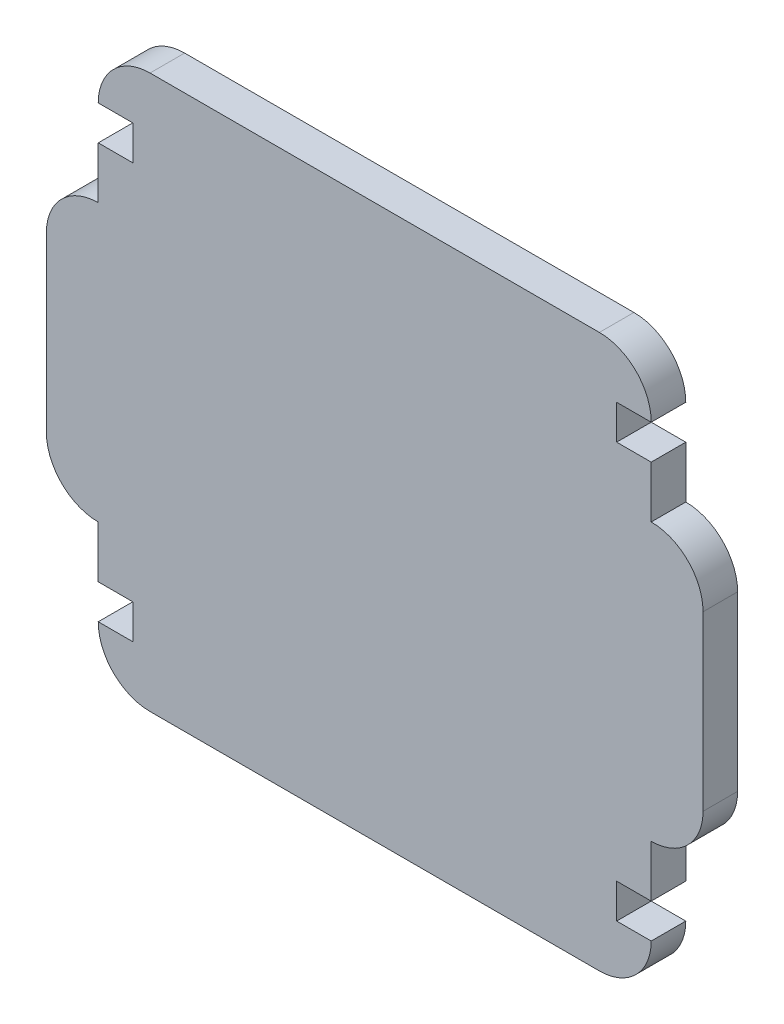
ISO-10303-21;
HEADER;
FILE_DESCRIPTION(('STEP AP214'),'2;1');
FILE_NAME('part.step','',(''),(''),'','','');
FILE_SCHEMA(('AUTOMOTIVE_DESIGN { 1 0 10303 214 1 1 1 1 }'));
ENDSEC;
DATA;
#1=APPLICATION_CONTEXT('core data for automotive mechanical design processes');
#2=APPLICATION_PROTOCOL_DEFINITION('international standard','automotive_design',2000,#1);
#3=PRODUCT_CONTEXT('',#1,'mechanical');
#4=PRODUCT('Part','Part','',(#3));
#5=PRODUCT_RELATED_PRODUCT_CATEGORY('part','',(#4));
#6=PRODUCT_DEFINITION_FORMATION('','',#4);
#7=PRODUCT_DEFINITION_CONTEXT('part definition',#1,'design');
#8=PRODUCT_DEFINITION('design','',#6,#7);
#9=PRODUCT_DEFINITION_SHAPE('','',#8);
#10=(LENGTH_UNIT() NAMED_UNIT(*) SI_UNIT(.MILLI.,.METRE.));
#11=(NAMED_UNIT(*) PLANE_ANGLE_UNIT() SI_UNIT($,.RADIAN.));
#12=(NAMED_UNIT(*) SI_UNIT($,.STERADIAN.) SOLID_ANGLE_UNIT());
#13=UNCERTAINTY_MEASURE_WITH_UNIT(LENGTH_MEASURE(1.E-05),#10,'distance_accuracy_value','');
#14=(GEOMETRIC_REPRESENTATION_CONTEXT(3) GLOBAL_UNCERTAINTY_ASSIGNED_CONTEXT((#13)) GLOBAL_UNIT_ASSIGNED_CONTEXT((#10,
#11,#12)) REPRESENTATION_CONTEXT('',''));
#15=CARTESIAN_POINT('',(0.,0.,0.));
#16=DIRECTION('',(0.,0.,1.));
#17=DIRECTION('',(1.,0.,0.));
#18=AXIS2_PLACEMENT_3D('',#15,#16,#17);
#19=CARTESIAN_POINT('',(-25.4,-7.93750000000001,3.175));
#20=DIRECTION('',(0.,0.,-1.));
#21=DIRECTION('',(-1.,0.,0.));
#22=AXIS2_PLACEMENT_3D('',#19,#20,#21);
#23=CYLINDRICAL_SURFACE('',#22,4.7625);
#24=CARTESIAN_POINT('',(-25.4,-7.93750000000001,0.));
#25=DIRECTION('',(0.,0.,1.));
#26=DIRECTION('',(1.,0.,0.));
#27=AXIS2_PLACEMENT_3D('',#24,#25,#26);
#28=CIRCLE('',#27,4.7625);
#29=CARTESIAN_POINT('',(-25.4,-12.7,0.));
#30=VERTEX_POINT('',#29);
#31=CARTESIAN_POINT('',(-30.1625,-7.93750000000001,0.));
#32=VERTEX_POINT('',#31);
#33=EDGE_CURVE('E250',#30,#32,#28,.F.);
#34=ORIENTED_EDGE('',*,*,#33,.F.);
#35=DIRECTION('',(0.,0.,-1.));
#36=VECTOR('',#35,1.);
#37=CARTESIAN_POINT('',(-25.4,-12.7,3.175));
#38=LINE('',#37,#36);
#39=CARTESIAN_POINT('',(-25.4,-12.7,3.175));
#40=VERTEX_POINT('',#39);
#41=EDGE_CURVE('E11',#40,#30,#38,.T.);
#42=ORIENTED_EDGE('',*,*,#41,.F.);
#43=CARTESIAN_POINT('',(-25.4,-7.93750000000001,3.175));
#44=DIRECTION('',(0.,0.,1.));
#45=DIRECTION('',(1.,0.,0.));
#46=AXIS2_PLACEMENT_3D('',#43,#44,#45);
#47=CIRCLE('',#46,4.7625);
#48=CARTESIAN_POINT('',(-30.1625,-7.93750000000001,3.175));
#49=VERTEX_POINT('',#48);
#50=EDGE_CURVE('E324',#40,#49,#47,.F.);
#51=ORIENTED_EDGE('',*,*,#50,.T.);
#52=DIRECTION('',(0.,0.,-1.));
#53=VECTOR('',#52,1.);
#54=CARTESIAN_POINT('',(-30.1625,-7.93750000000001,3.175));
#55=LINE('',#54,#53);
#56=EDGE_CURVE('E52',#49,#32,#55,.T.);
#57=ORIENTED_EDGE('',*,*,#56,.T.);
#58=EDGE_LOOP('',(#34,#42,#51,#57));
#59=FACE_BOUND('',#58,.T.);
#60=ADVANCED_FACE('F36',(#59),#23,.T.);
#61=CARTESIAN_POINT('',(-25.4,0.,3.175));
#62=DIRECTION('',(1.,0.,0.));
#63=DIRECTION('',(0.,0.,-1.));
#64=AXIS2_PLACEMENT_3D('',#61,#62,#63);
#65=PLANE('',#64);
#66=DIRECTION('',(0.,-1.,0.));
#67=VECTOR('',#66,1.);
#68=CARTESIAN_POINT('',(-25.4,0.,0.));
#69=LINE('',#68,#67);
#70=CARTESIAN_POINT('',(-25.4,-17.4625,0.));
#71=VERTEX_POINT('',#70);
#72=EDGE_CURVE('E252',#30,#71,#69,.T.);
#73=ORIENTED_EDGE('',*,*,#72,.T.);
#74=DIRECTION('',(0.,0.,-1.));
#75=VECTOR('',#74,1.);
#76=CARTESIAN_POINT('',(-25.4,-17.4625,3.175));
#77=LINE('',#76,#75);
#78=CARTESIAN_POINT('',(-25.4,-17.4625,3.175));
#79=VERTEX_POINT('',#78);
#80=EDGE_CURVE('E44',#79,#71,#77,.T.);
#81=ORIENTED_EDGE('',*,*,#80,.F.);
#82=DIRECTION('',(0.,-1.,0.));
#83=VECTOR('',#82,1.);
#84=CARTESIAN_POINT('',(-25.4,0.,3.175));
#85=LINE('',#84,#83);
#86=EDGE_CURVE('E397',#40,#79,#85,.T.);
#87=ORIENTED_EDGE('',*,*,#86,.F.);
#88=ORIENTED_EDGE('',*,*,#41,.T.);
#89=EDGE_LOOP('',(#73,#81,#87,#88));
#90=FACE_BOUND('',#89,.T.);
#91=ADVANCED_FACE('F385',(#90),#65,.F.);
#92=CARTESIAN_POINT('',(0.,-17.4625,3.175));
#93=DIRECTION('',(0.,-1.,0.));
#94=DIRECTION('',(0.,0.,-1.));
#95=AXIS2_PLACEMENT_3D('',#92,#93,#94);
#96=PLANE('',#95);
#97=DIRECTION('',(-1.,0.,0.));
#98=VECTOR('',#97,1.);
#99=CARTESIAN_POINT('',(0.,-17.4625,0.));
#100=LINE('',#99,#98);
#101=CARTESIAN_POINT('',(-22.225,-17.4625,0.));
#102=VERTEX_POINT('',#101);
#103=EDGE_CURVE('E255',#102,#71,#100,.T.);
#104=ORIENTED_EDGE('',*,*,#103,.F.);
#105=DIRECTION('',(0.,0.,-1.));
#106=VECTOR('',#105,1.);
#107=CARTESIAN_POINT('',(-22.225,-17.4625,3.175));
#108=LINE('',#107,#106);
#109=CARTESIAN_POINT('',(-22.225,-17.4625,3.175));
#110=VERTEX_POINT('',#109);
#111=EDGE_CURVE('E375',#110,#102,#108,.T.);
#112=ORIENTED_EDGE('',*,*,#111,.F.);
#113=DIRECTION('',(-1.,0.,0.));
#114=VECTOR('',#113,1.);
#115=CARTESIAN_POINT('',(0.,-17.4625,3.175));
#116=LINE('',#115,#114);
#117=EDGE_CURVE('E382',#110,#79,#116,.T.);
#118=ORIENTED_EDGE('',*,*,#117,.T.);
#119=ORIENTED_EDGE('',*,*,#80,.T.);
#120=EDGE_LOOP('',(#104,#112,#118,#119));
#121=FACE_BOUND('',#120,.T.);
#122=ADVANCED_FACE('F380',(#121),#96,.T.);
#123=CARTESIAN_POINT('',(-22.225,0.,3.175));
#124=DIRECTION('',(-1.,0.,0.));
#125=DIRECTION('',(0.,0.,1.));
#126=AXIS2_PLACEMENT_3D('',#123,#124,#125);
#127=PLANE('',#126);
#128=DIRECTION('',(0.,1.,0.));
#129=VECTOR('',#128,1.);
#130=CARTESIAN_POINT('',(-22.225,0.,0.));
#131=LINE('',#130,#129);
#132=CARTESIAN_POINT('',(-22.225,-20.6375,0.));
#133=VERTEX_POINT('',#132);
#134=EDGE_CURVE('E258',#133,#102,#131,.T.);
#135=ORIENTED_EDGE('',*,*,#134,.F.);
#136=DIRECTION('',(0.,0.,-1.));
#137=VECTOR('',#136,1.);
#138=CARTESIAN_POINT('',(-22.225,-20.6375,3.175));
#139=LINE('',#138,#137);
#140=CARTESIAN_POINT('',(-22.225,-20.6375,3.175));
#141=VERTEX_POINT('',#140);
#142=EDGE_CURVE('E373',#141,#133,#139,.T.);
#143=ORIENTED_EDGE('',*,*,#142,.F.);
#144=DIRECTION('',(0.,1.,0.));
#145=VECTOR('',#144,1.);
#146=CARTESIAN_POINT('',(-22.225,0.,3.175));
#147=LINE('',#146,#145);
#148=EDGE_CURVE('E396',#141,#110,#147,.T.);
#149=ORIENTED_EDGE('',*,*,#148,.T.);
#150=ORIENTED_EDGE('',*,*,#111,.T.);
#151=EDGE_LOOP('',(#135,#143,#149,#150));
#152=FACE_BOUND('',#151,.T.);
#153=ADVANCED_FACE('F392',(#152),#127,.T.);
#154=CARTESIAN_POINT('',(0.,-20.6375,3.175));
#155=DIRECTION('',(0.,-1.,0.));
#156=DIRECTION('',(1.,0.,0.));
#157=AXIS2_PLACEMENT_3D('',#154,#155,#156);
#158=PLANE('',#157);
#159=DIRECTION('',(-1.,0.,0.));
#160=VECTOR('',#159,1.);
#161=CARTESIAN_POINT('',(0.,-20.6375,0.));
#162=LINE('',#161,#160);
#163=CARTESIAN_POINT('',(-25.4,-20.6375,0.));
#164=VERTEX_POINT('',#163);
#165=EDGE_CURVE('E261',#133,#164,#162,.T.);
#166=ORIENTED_EDGE('',*,*,#165,.T.);
#167=DIRECTION('',(0.,0.,-1.));
#168=VECTOR('',#167,1.);
#169=CARTESIAN_POINT('',(-25.4,-20.6375,3.175));
#170=LINE('',#169,#168);
#171=CARTESIAN_POINT('',(-25.4,-20.6375,3.175));
#172=VERTEX_POINT('',#171);
#173=EDGE_CURVE('E370',#172,#164,#170,.T.);
#174=ORIENTED_EDGE('',*,*,#173,.F.);
#175=DIRECTION('',(-1.,0.,0.));
#176=VECTOR('',#175,1.);
#177=CARTESIAN_POINT('',(0.,-20.6375,3.175));
#178=LINE('',#177,#176);
#179=EDGE_CURVE('E399',#141,#172,#178,.T.);
#180=ORIENTED_EDGE('',*,*,#179,.F.);
#181=ORIENTED_EDGE('',*,*,#142,.T.);
#182=EDGE_LOOP('',(#166,#174,#180,#181));
#183=FACE_BOUND('',#182,.T.);
#184=ADVANCED_FACE('F484',(#183),#158,.F.);
#185=CARTESIAN_POINT('',(-20.6375,-20.6375,3.175));
#186=DIRECTION('',(0.,0.,-1.));
#187=DIRECTION('',(-1.,0.,0.));
#188=AXIS2_PLACEMENT_3D('',#185,#186,#187);
#189=CYLINDRICAL_SURFACE('',#188,4.7625);
#190=CARTESIAN_POINT('',(-20.6375,-20.6375,0.));
#191=DIRECTION('',(0.,0.,1.));
#192=DIRECTION('',(1.,0.,0.));
#193=AXIS2_PLACEMENT_3D('',#190,#191,#192);
#194=CIRCLE('',#193,4.7625);
#195=CARTESIAN_POINT('',(-20.6375,-25.4,0.));
#196=VERTEX_POINT('',#195);
#197=EDGE_CURVE('E263',#164,#196,#194,.T.);
#198=ORIENTED_EDGE('',*,*,#197,.T.);
#199=DIRECTION('',(0.,0.,-1.));
#200=VECTOR('',#199,1.);
#201=CARTESIAN_POINT('',(-20.6375,-25.4,3.175));
#202=LINE('',#201,#200);
#203=CARTESIAN_POINT('',(-20.6375,-25.4,3.175));
#204=VERTEX_POINT('',#203);
#205=EDGE_CURVE('E367',#204,#196,#202,.T.);
#206=ORIENTED_EDGE('',*,*,#205,.F.);
#207=CARTESIAN_POINT('',(-20.6375,-20.6375,3.175));
#208=DIRECTION('',(0.,0.,1.));
#209=DIRECTION('',(1.,0.,0.));
#210=AXIS2_PLACEMENT_3D('',#207,#208,#209);
#211=CIRCLE('',#210,4.7625);
#212=EDGE_CURVE('E405',#172,#204,#211,.T.);
#213=ORIENTED_EDGE('',*,*,#212,.F.);
#214=ORIENTED_EDGE('',*,*,#173,.T.);
#215=EDGE_LOOP('',(#198,#206,#213,#214));
#216=FACE_BOUND('',#215,.T.);
#217=ADVANCED_FACE('F487',(#216),#189,.T.);
#218=CARTESIAN_POINT('',(0.,-25.4,3.175));
#219=DIRECTION('',(0.,1.,0.));
#220=DIRECTION('',(-1.,0.,0.));
#221=AXIS2_PLACEMENT_3D('',#218,#219,#220);
#222=PLANE('',#221);
#223=DIRECTION('',(1.,0.,0.));
#224=VECTOR('',#223,1.);
#225=CARTESIAN_POINT('',(0.,-25.4,0.));
#226=LINE('',#225,#224);
#227=CARTESIAN_POINT('',(20.6375,-25.4,0.));
#228=VERTEX_POINT('',#227);
#229=EDGE_CURVE('E265',#196,#228,#226,.T.);
#230=ORIENTED_EDGE('',*,*,#229,.T.);
#231=DIRECTION('',(0.,0.,-1.));
#232=VECTOR('',#231,1.);
#233=CARTESIAN_POINT('',(20.6375,-25.4,3.175));
#234=LINE('',#233,#232);
#235=CARTESIAN_POINT('',(20.6375,-25.4,3.175));
#236=VERTEX_POINT('',#235);
#237=EDGE_CURVE('E365',#236,#228,#234,.T.);
#238=ORIENTED_EDGE('',*,*,#237,.F.);
#239=DIRECTION('',(1.,0.,0.));
#240=VECTOR('',#239,1.);
#241=CARTESIAN_POINT('',(0.,-25.4,3.175));
#242=LINE('',#241,#240);
#243=EDGE_CURVE('E407',#204,#236,#242,.T.);
#244=ORIENTED_EDGE('',*,*,#243,.F.);
#245=ORIENTED_EDGE('',*,*,#205,.T.);
#246=EDGE_LOOP('',(#230,#238,#244,#245));
#247=FACE_BOUND('',#246,.T.);
#248=ADVANCED_FACE('F491',(#247),#222,.F.);
#249=CARTESIAN_POINT('',(20.6375,-20.6375,3.175));
#250=DIRECTION('',(0.,0.,-1.));
#251=DIRECTION('',(-1.,0.,0.));
#252=AXIS2_PLACEMENT_3D('',#249,#250,#251);
#253=CYLINDRICAL_SURFACE('',#252,4.76249999999999);
#254=CARTESIAN_POINT('',(20.6375,-20.6375,0.));
#255=DIRECTION('',(0.,0.,1.));
#256=DIRECTION('',(1.,0.,0.));
#257=AXIS2_PLACEMENT_3D('',#254,#255,#256);
#258=CIRCLE('',#257,4.76249999999999);
#259=CARTESIAN_POINT('',(25.4,-20.6375,0.));
#260=VERTEX_POINT('',#259);
#261=EDGE_CURVE('E268',#260,#228,#258,.F.);
#262=ORIENTED_EDGE('',*,*,#261,.F.);
#263=DIRECTION('',(0.,0.,-1.));
#264=VECTOR('',#263,1.);
#265=CARTESIAN_POINT('',(25.4,-20.6375,3.175));
#266=LINE('',#265,#264);
#267=CARTESIAN_POINT('',(25.4,-20.6375,3.175));
#268=VERTEX_POINT('',#267);
#269=EDGE_CURVE('E363',#268,#260,#266,.T.);
#270=ORIENTED_EDGE('',*,*,#269,.F.);
#271=CARTESIAN_POINT('',(20.6375,-20.6375,3.175));
#272=DIRECTION('',(0.,0.,1.));
#273=DIRECTION('',(1.,0.,0.));
#274=AXIS2_PLACEMENT_3D('',#271,#272,#273);
#275=CIRCLE('',#274,4.76249999999999);
#276=EDGE_CURVE('E409',#268,#236,#275,.F.);
#277=ORIENTED_EDGE('',*,*,#276,.T.);
#278=ORIENTED_EDGE('',*,*,#237,.T.);
#279=EDGE_LOOP('',(#262,#270,#277,#278));
#280=FACE_BOUND('',#279,.T.);
#281=ADVANCED_FACE('F495',(#280),#253,.T.);
#282=CARTESIAN_POINT('',(0.,-20.6375,3.175));
#283=DIRECTION('',(0.,1.,0.));
#284=DIRECTION('',(-1.,0.,0.));
#285=AXIS2_PLACEMENT_3D('',#282,#283,#284);
#286=PLANE('',#285);
#287=DIRECTION('',(1.,0.,0.));
#288=VECTOR('',#287,1.);
#289=CARTESIAN_POINT('',(0.,-20.6375,0.));
#290=LINE('',#289,#288);
#291=CARTESIAN_POINT('',(22.225,-20.6375,0.));
#292=VERTEX_POINT('',#291);
#293=EDGE_CURVE('E271',#292,#260,#290,.T.);
#294=ORIENTED_EDGE('',*,*,#293,.F.);
#295=DIRECTION('',(0.,0.,-1.));
#296=VECTOR('',#295,1.);
#297=CARTESIAN_POINT('',(22.225,-20.6375,3.175));
#298=LINE('',#297,#296);
#299=CARTESIAN_POINT('',(22.225,-20.6375,3.175));
#300=VERTEX_POINT('',#299);
#301=EDGE_CURVE('E361',#300,#292,#298,.T.);
#302=ORIENTED_EDGE('',*,*,#301,.F.);
#303=DIRECTION('',(1.,0.,0.));
#304=VECTOR('',#303,1.);
#305=CARTESIAN_POINT('',(0.,-20.6375,3.175));
#306=LINE('',#305,#304);
#307=EDGE_CURVE('E412',#300,#268,#306,.T.);
#308=ORIENTED_EDGE('',*,*,#307,.T.);
#309=ORIENTED_EDGE('',*,*,#269,.T.);
#310=EDGE_LOOP('',(#294,#302,#308,#309));
#311=FACE_BOUND('',#310,.T.);
#312=ADVANCED_FACE('F499',(#311),#286,.T.);
#313=CARTESIAN_POINT('',(22.225,0.,3.175));
#314=DIRECTION('',(-1.,0.,0.));
#315=DIRECTION('',(0.,0.,1.));
#316=AXIS2_PLACEMENT_3D('',#313,#314,#315);
#317=PLANE('',#316);
#318=DIRECTION('',(0.,1.,0.));
#319=VECTOR('',#318,1.);
#320=CARTESIAN_POINT('',(22.225,0.,0.));
#321=LINE('',#320,#319);
#322=CARTESIAN_POINT('',(22.225,-17.4625,0.));
#323=VERTEX_POINT('',#322);
#324=EDGE_CURVE('E274',#292,#323,#321,.T.);
#325=ORIENTED_EDGE('',*,*,#324,.T.);
#326=DIRECTION('',(0.,0.,-1.));
#327=VECTOR('',#326,1.);
#328=CARTESIAN_POINT('',(22.225,-17.4625,3.175));
#329=LINE('',#328,#327);
#330=CARTESIAN_POINT('',(22.225,-17.4625,3.175));
#331=VERTEX_POINT('',#330);
#332=EDGE_CURVE('E358',#331,#323,#329,.T.);
#333=ORIENTED_EDGE('',*,*,#332,.F.);
#334=DIRECTION('',(0.,1.,0.));
#335=VECTOR('',#334,1.);
#336=CARTESIAN_POINT('',(22.225,0.,3.175));
#337=LINE('',#336,#335);
#338=EDGE_CURVE('E415',#300,#331,#337,.T.);
#339=ORIENTED_EDGE('',*,*,#338,.F.);
#340=ORIENTED_EDGE('',*,*,#301,.T.);
#341=EDGE_LOOP('',(#325,#333,#339,#340));
#342=FACE_BOUND('',#341,.T.);
#343=ADVANCED_FACE('F503',(#342),#317,.F.);
#344=CARTESIAN_POINT('',(0.,-17.4625,3.175));
#345=DIRECTION('',(0.,1.,0.));
#346=DIRECTION('',(0.,0.,1.));
#347=AXIS2_PLACEMENT_3D('',#344,#345,#346);
#348=PLANE('',#347);
#349=DIRECTION('',(1.,0.,0.));
#350=VECTOR('',#349,1.);
#351=CARTESIAN_POINT('',(0.,-17.4625,0.));
#352=LINE('',#351,#350);
#353=CARTESIAN_POINT('',(25.4,-17.4625,0.));
#354=VERTEX_POINT('',#353);
#355=EDGE_CURVE('E276',#323,#354,#352,.T.);
#356=ORIENTED_EDGE('',*,*,#355,.T.);
#357=DIRECTION('',(0.,0.,-1.));
#358=VECTOR('',#357,1.);
#359=CARTESIAN_POINT('',(25.4,-17.4625,3.175));
#360=LINE('',#359,#358);
#361=CARTESIAN_POINT('',(25.4,-17.4625,3.175));
#362=VERTEX_POINT('',#361);
#363=EDGE_CURVE('E356',#362,#354,#360,.T.);
#364=ORIENTED_EDGE('',*,*,#363,.F.);
#365=DIRECTION('',(1.,0.,0.));
#366=VECTOR('',#365,1.);
#367=CARTESIAN_POINT('',(0.,-17.4625,3.175));
#368=LINE('',#367,#366);
#369=EDGE_CURVE('E417',#331,#362,#368,.T.);
#370=ORIENTED_EDGE('',*,*,#369,.F.);
#371=ORIENTED_EDGE('',*,*,#332,.T.);
#372=EDGE_LOOP('',(#356,#364,#370,#371));
#373=FACE_BOUND('',#372,.T.);
#374=ADVANCED_FACE('F507',(#373),#348,.F.);
#375=CARTESIAN_POINT('',(25.4,0.,3.175));
#376=DIRECTION('',(1.,0.,0.));
#377=DIRECTION('',(0.,0.,-1.));
#378=AXIS2_PLACEMENT_3D('',#375,#376,#377);
#379=PLANE('',#378);
#380=DIRECTION('',(0.,-1.,0.));
#381=VECTOR('',#380,1.);
#382=CARTESIAN_POINT('',(25.4,0.,0.));
#383=LINE('',#382,#381);
#384=CARTESIAN_POINT('',(25.4,-12.7,0.));
#385=VERTEX_POINT('',#384);
#386=EDGE_CURVE('E279',#385,#354,#383,.T.);
#387=ORIENTED_EDGE('',*,*,#386,.F.);
#388=DIRECTION('',(0.,0.,-1.));
#389=VECTOR('',#388,1.);
#390=CARTESIAN_POINT('',(25.4,-12.7,3.175));
#391=LINE('',#390,#389);
#392=CARTESIAN_POINT('',(25.4,-12.7,3.175));
#393=VERTEX_POINT('',#392);
#394=EDGE_CURVE('E354',#393,#385,#391,.T.);
#395=ORIENTED_EDGE('',*,*,#394,.F.);
#396=DIRECTION('',(0.,-1.,0.));
#397=VECTOR('',#396,1.);
#398=CARTESIAN_POINT('',(25.4,0.,3.175));
#399=LINE('',#398,#397);
#400=EDGE_CURVE('E419',#393,#362,#399,.T.);
#401=ORIENTED_EDGE('',*,*,#400,.T.);
#402=ORIENTED_EDGE('',*,*,#363,.T.);
#403=EDGE_LOOP('',(#387,#395,#401,#402));
#404=FACE_BOUND('',#403,.T.);
#405=ADVANCED_FACE('F511',(#404),#379,.T.);
#406=CARTESIAN_POINT('',(25.4,-7.93750000000001,3.175));
#407=DIRECTION('',(0.,0.,-1.));
#408=DIRECTION('',(-1.,0.,0.));
#409=AXIS2_PLACEMENT_3D('',#406,#407,#408);
#410=CYLINDRICAL_SURFACE('',#409,4.7625);
#411=CARTESIAN_POINT('',(25.4,-7.93750000000001,0.));
#412=DIRECTION('',(0.,0.,1.));
#413=DIRECTION('',(1.,0.,0.));
#414=AXIS2_PLACEMENT_3D('',#411,#412,#413);
#415=CIRCLE('',#414,4.7625);
#416=CARTESIAN_POINT('',(30.1625,-7.93750000000001,0.));
#417=VERTEX_POINT('',#416);
#418=EDGE_CURVE('E282',#385,#417,#415,.T.);
#419=ORIENTED_EDGE('',*,*,#418,.T.);
#420=DIRECTION('',(0.,0.,-1.));
#421=VECTOR('',#420,1.);
#422=CARTESIAN_POINT('',(30.1625,-7.93750000000001,3.175));
#423=LINE('',#422,#421);
#424=CARTESIAN_POINT('',(30.1625,-7.93750000000001,3.175));
#425=VERTEX_POINT('',#424);
#426=EDGE_CURVE('E352',#425,#417,#423,.T.);
#427=ORIENTED_EDGE('',*,*,#426,.F.);
#428=CARTESIAN_POINT('',(25.4,-7.93750000000001,3.175));
#429=DIRECTION('',(0.,0.,1.));
#430=DIRECTION('',(1.,0.,0.));
#431=AXIS2_PLACEMENT_3D('',#428,#429,#430);
#432=CIRCLE('',#431,4.7625);
#433=EDGE_CURVE('E422',#393,#425,#432,.T.);
#434=ORIENTED_EDGE('',*,*,#433,.F.);
#435=ORIENTED_EDGE('',*,*,#394,.T.);
#436=EDGE_LOOP('',(#419,#427,#434,#435));
#437=FACE_BOUND('',#436,.T.);
#438=ADVANCED_FACE('F515',(#437),#410,.T.);
#439=CARTESIAN_POINT('',(30.1625,0.,3.175));
#440=DIRECTION('',(1.,0.,0.));
#441=DIRECTION('',(0.,0.,-1.));
#442=AXIS2_PLACEMENT_3D('',#439,#440,#441);
#443=PLANE('',#442);
#444=DIRECTION('',(0.,-1.,0.));
#445=VECTOR('',#444,1.);
#446=CARTESIAN_POINT('',(30.1625,0.,0.));
#447=LINE('',#446,#445);
#448=CARTESIAN_POINT('',(30.1625,7.93750000000001,0.));
#449=VERTEX_POINT('',#448);
#450=EDGE_CURVE('E285',#449,#417,#447,.T.);
#451=ORIENTED_EDGE('',*,*,#450,.F.);
#452=DIRECTION('',(0.,0.,-1.));
#453=VECTOR('',#452,1.);
#454=CARTESIAN_POINT('',(30.1625,7.93750000000001,3.175));
#455=LINE('',#454,#453);
#456=CARTESIAN_POINT('',(30.1625,7.93750000000001,3.175));
#457=VERTEX_POINT('',#456);
#458=EDGE_CURVE('E350',#457,#449,#455,.T.);
#459=ORIENTED_EDGE('',*,*,#458,.F.);
#460=DIRECTION('',(0.,-1.,0.));
#461=VECTOR('',#460,1.);
#462=CARTESIAN_POINT('',(30.1625,0.,3.175));
#463=LINE('',#462,#461);
#464=EDGE_CURVE('E424',#457,#425,#463,.T.);
#465=ORIENTED_EDGE('',*,*,#464,.T.);
#466=ORIENTED_EDGE('',*,*,#426,.T.);
#467=EDGE_LOOP('',(#451,#459,#465,#466));
#468=FACE_BOUND('',#467,.T.);
#469=ADVANCED_FACE('F519',(#468),#443,.T.);
#470=CARTESIAN_POINT('',(25.4,7.93750000000001,3.175));
#471=DIRECTION('',(0.,0.,-1.));
#472=DIRECTION('',(-1.,0.,0.));
#473=AXIS2_PLACEMENT_3D('',#470,#471,#472);
#474=CYLINDRICAL_SURFACE('',#473,4.7625);
#475=CARTESIAN_POINT('',(25.4,7.93750000000001,0.));
#476=DIRECTION('',(0.,0.,1.));
#477=DIRECTION('',(1.,0.,0.));
#478=AXIS2_PLACEMENT_3D('',#475,#476,#477);
#479=CIRCLE('',#478,4.7625);
#480=CARTESIAN_POINT('',(25.4,12.7,0.));
#481=VERTEX_POINT('',#480);
#482=EDGE_CURVE('E288',#481,#449,#479,.F.);
#483=ORIENTED_EDGE('',*,*,#482,.F.);
#484=DIRECTION('',(0.,0.,-1.));
#485=VECTOR('',#484,1.);
#486=CARTESIAN_POINT('',(25.4,12.7,3.175));
#487=LINE('',#486,#485);
#488=CARTESIAN_POINT('',(25.4,12.7,3.175));
#489=VERTEX_POINT('',#488);
#490=EDGE_CURVE('E348',#489,#481,#487,.T.);
#491=ORIENTED_EDGE('',*,*,#490,.F.);
#492=CARTESIAN_POINT('',(25.4,7.93750000000001,3.175));
#493=DIRECTION('',(0.,0.,1.));
#494=DIRECTION('',(1.,0.,0.));
#495=AXIS2_PLACEMENT_3D('',#492,#493,#494);
#496=CIRCLE('',#495,4.7625);
#497=EDGE_CURVE('E427',#489,#457,#496,.F.);
#498=ORIENTED_EDGE('',*,*,#497,.T.);
#499=ORIENTED_EDGE('',*,*,#458,.T.);
#500=EDGE_LOOP('',(#483,#491,#498,#499));
#501=FACE_BOUND('',#500,.T.);
#502=ADVANCED_FACE('F523',(#501),#474,.T.);
#503=CARTESIAN_POINT('',(25.4,0.,3.175));
#504=DIRECTION('',(1.,0.,0.));
#505=DIRECTION('',(0.,0.,-1.));
#506=AXIS2_PLACEMENT_3D('',#503,#504,#505);
#507=PLANE('',#506);
#508=DIRECTION('',(0.,-1.,0.));
#509=VECTOR('',#508,1.);
#510=CARTESIAN_POINT('',(25.4,0.,0.));
#511=LINE('',#510,#509);
#512=CARTESIAN_POINT('',(25.4,17.4625,0.));
#513=VERTEX_POINT('',#512);
#514=EDGE_CURVE('E291',#513,#481,#511,.T.);
#515=ORIENTED_EDGE('',*,*,#514,.F.);
#516=DIRECTION('',(0.,0.,-1.));
#517=VECTOR('',#516,1.);
#518=CARTESIAN_POINT('',(25.4,17.4625,3.175));
#519=LINE('',#518,#517);
#520=CARTESIAN_POINT('',(25.4,17.4625,3.175));
#521=VERTEX_POINT('',#520);
#522=EDGE_CURVE('E346',#521,#513,#519,.T.);
#523=ORIENTED_EDGE('',*,*,#522,.F.);
#524=DIRECTION('',(0.,-1.,0.));
#525=VECTOR('',#524,1.);
#526=CARTESIAN_POINT('',(25.4,0.,3.175));
#527=LINE('',#526,#525);
#528=EDGE_CURVE('E430',#521,#489,#527,.T.);
#529=ORIENTED_EDGE('',*,*,#528,.T.);
#530=ORIENTED_EDGE('',*,*,#490,.T.);
#531=EDGE_LOOP('',(#515,#523,#529,#530));
#532=FACE_BOUND('',#531,.T.);
#533=ADVANCED_FACE('F527',(#532),#507,.T.);
#534=CARTESIAN_POINT('',(0.,17.4625,3.175));
#535=DIRECTION('',(0.,1.,0.));
#536=DIRECTION('',(0.,0.,1.));
#537=AXIS2_PLACEMENT_3D('',#534,#535,#536);
#538=PLANE('',#537);
#539=DIRECTION('',(1.,0.,0.));
#540=VECTOR('',#539,1.);
#541=CARTESIAN_POINT('',(0.,17.4625,0.));
#542=LINE('',#541,#540);
#543=CARTESIAN_POINT('',(22.225,17.4625,0.));
#544=VERTEX_POINT('',#543);
#545=EDGE_CURVE('E294',#544,#513,#542,.T.);
#546=ORIENTED_EDGE('',*,*,#545,.F.);
#547=DIRECTION('',(0.,0.,-1.));
#548=VECTOR('',#547,1.);
#549=CARTESIAN_POINT('',(22.225,17.4625,3.175));
#550=LINE('',#549,#548);
#551=CARTESIAN_POINT('',(22.225,17.4625,3.175));
#552=VERTEX_POINT('',#551);
#553=EDGE_CURVE('E344',#552,#544,#550,.T.);
#554=ORIENTED_EDGE('',*,*,#553,.F.);
#555=DIRECTION('',(1.,0.,0.));
#556=VECTOR('',#555,1.);
#557=CARTESIAN_POINT('',(0.,17.4625,3.175));
#558=LINE('',#557,#556);
#559=EDGE_CURVE('E433',#552,#521,#558,.T.);
#560=ORIENTED_EDGE('',*,*,#559,.T.);
#561=ORIENTED_EDGE('',*,*,#522,.T.);
#562=EDGE_LOOP('',(#546,#554,#560,#561));
#563=FACE_BOUND('',#562,.T.);
#564=ADVANCED_FACE('F531',(#563),#538,.T.);
#565=CARTESIAN_POINT('',(22.225,0.,3.175));
#566=DIRECTION('',(1.,0.,0.));
#567=DIRECTION('',(0.,0.,-1.));
#568=AXIS2_PLACEMENT_3D('',#565,#566,#567);
#569=PLANE('',#568);
#570=DIRECTION('',(0.,-1.,0.));
#571=VECTOR('',#570,1.);
#572=CARTESIAN_POINT('',(22.225,0.,0.));
#573=LINE('',#572,#571);
#574=CARTESIAN_POINT('',(22.225,20.6375,0.));
#575=VERTEX_POINT('',#574);
#576=EDGE_CURVE('E297',#575,#544,#573,.T.);
#577=ORIENTED_EDGE('',*,*,#576,.F.);
#578=DIRECTION('',(0.,0.,-1.));
#579=VECTOR('',#578,1.);
#580=CARTESIAN_POINT('',(22.225,20.6375,3.175));
#581=LINE('',#580,#579);
#582=CARTESIAN_POINT('',(22.225,20.6375,3.175));
#583=VERTEX_POINT('',#582);
#584=EDGE_CURVE('E342',#583,#575,#581,.T.);
#585=ORIENTED_EDGE('',*,*,#584,.F.);
#586=DIRECTION('',(0.,-1.,0.));
#587=VECTOR('',#586,1.);
#588=CARTESIAN_POINT('',(22.225,0.,3.175));
#589=LINE('',#588,#587);
#590=EDGE_CURVE('E436',#583,#552,#589,.T.);
#591=ORIENTED_EDGE('',*,*,#590,.T.);
#592=ORIENTED_EDGE('',*,*,#553,.T.);
#593=EDGE_LOOP('',(#577,#585,#591,#592));
#594=FACE_BOUND('',#593,.T.);
#595=ADVANCED_FACE('F535',(#594),#569,.T.);
#596=CARTESIAN_POINT('',(0.,20.6375,3.175));
#597=DIRECTION('',(0.,1.,0.));
#598=DIRECTION('',(-1.,0.,0.));
#599=AXIS2_PLACEMENT_3D('',#596,#597,#598);
#600=PLANE('',#599);
#601=DIRECTION('',(1.,0.,0.));
#602=VECTOR('',#601,1.);
#603=CARTESIAN_POINT('',(0.,20.6375,0.));
#604=LINE('',#603,#602);
#605=CARTESIAN_POINT('',(25.4,20.6375,0.));
#606=VERTEX_POINT('',#605);
#607=EDGE_CURVE('E300',#575,#606,#604,.T.);
#608=ORIENTED_EDGE('',*,*,#607,.T.);
#609=DIRECTION('',(0.,0.,-1.));
#610=VECTOR('',#609,1.);
#611=CARTESIAN_POINT('',(25.4,20.6375,3.175));
#612=LINE('',#611,#610);
#613=CARTESIAN_POINT('',(25.4,20.6375,3.175));
#614=VERTEX_POINT('',#613);
#615=EDGE_CURVE('E339',#614,#606,#612,.T.);
#616=ORIENTED_EDGE('',*,*,#615,.F.);
#617=DIRECTION('',(1.,0.,0.));
#618=VECTOR('',#617,1.);
#619=CARTESIAN_POINT('',(0.,20.6375,3.175));
#620=LINE('',#619,#618);
#621=EDGE_CURVE('E439',#583,#614,#620,.T.);
#622=ORIENTED_EDGE('',*,*,#621,.F.);
#623=ORIENTED_EDGE('',*,*,#584,.T.);
#624=EDGE_LOOP('',(#608,#616,#622,#623));
#625=FACE_BOUND('',#624,.T.);
#626=ADVANCED_FACE('F539',(#625),#600,.F.);
#627=CARTESIAN_POINT('',(20.6375,20.6375,3.175));
#628=DIRECTION('',(0.,0.,-1.));
#629=DIRECTION('',(-1.,0.,0.));
#630=AXIS2_PLACEMENT_3D('',#627,#628,#629);
#631=CYLINDRICAL_SURFACE('',#630,4.76249999999999);
#632=CARTESIAN_POINT('',(20.6375,20.6375,0.));
#633=DIRECTION('',(0.,0.,1.));
#634=DIRECTION('',(1.,0.,0.));
#635=AXIS2_PLACEMENT_3D('',#632,#633,#634);
#636=CIRCLE('',#635,4.76249999999999);
#637=CARTESIAN_POINT('',(20.6375,25.4,0.));
#638=VERTEX_POINT('',#637);
#639=EDGE_CURVE('E302',#606,#638,#636,.T.);
#640=ORIENTED_EDGE('',*,*,#639,.T.);
#641=DIRECTION('',(0.,0.,-1.));
#642=VECTOR('',#641,1.);
#643=CARTESIAN_POINT('',(20.6375,25.4,3.175));
#644=LINE('',#643,#642);
#645=CARTESIAN_POINT('',(20.6375,25.4,3.175));
#646=VERTEX_POINT('',#645);
#647=EDGE_CURVE('E337',#646,#638,#644,.T.);
#648=ORIENTED_EDGE('',*,*,#647,.F.);
#649=CARTESIAN_POINT('',(20.6375,20.6375,3.175));
#650=DIRECTION('',(0.,0.,1.));
#651=DIRECTION('',(1.,0.,0.));
#652=AXIS2_PLACEMENT_3D('',#649,#650,#651);
#653=CIRCLE('',#652,4.76249999999999);
#654=EDGE_CURVE('E441',#614,#646,#653,.T.);
#655=ORIENTED_EDGE('',*,*,#654,.F.);
#656=ORIENTED_EDGE('',*,*,#615,.T.);
#657=EDGE_LOOP('',(#640,#648,#655,#656));
#658=FACE_BOUND('',#657,.T.);
#659=ADVANCED_FACE('F543',(#658),#631,.T.);
#660=CARTESIAN_POINT('',(0.,25.4,3.175));
#661=DIRECTION('',(0.,1.,0.));
#662=DIRECTION('',(-1.,0.,0.));
#663=AXIS2_PLACEMENT_3D('',#660,#661,#662);
#664=PLANE('',#663);
#665=DIRECTION('',(1.,0.,0.));
#666=VECTOR('',#665,1.);
#667=CARTESIAN_POINT('',(0.,25.4,0.));
#668=LINE('',#667,#666);
#669=CARTESIAN_POINT('',(-20.6375,25.4,0.));
#670=VERTEX_POINT('',#669);
#671=EDGE_CURVE('E305',#670,#638,#668,.T.);
#672=ORIENTED_EDGE('',*,*,#671,.F.);
#673=DIRECTION('',(0.,0.,-1.));
#674=VECTOR('',#673,1.);
#675=CARTESIAN_POINT('',(-20.6375,25.4,3.175));
#676=LINE('',#675,#674);
#677=CARTESIAN_POINT('',(-20.6375,25.4,3.175));
#678=VERTEX_POINT('',#677);
#679=EDGE_CURVE('E335',#678,#670,#676,.T.);
#680=ORIENTED_EDGE('',*,*,#679,.F.);
#681=DIRECTION('',(1.,0.,0.));
#682=VECTOR('',#681,1.);
#683=CARTESIAN_POINT('',(0.,25.4,3.175));
#684=LINE('',#683,#682);
#685=EDGE_CURVE('E443',#678,#646,#684,.T.);
#686=ORIENTED_EDGE('',*,*,#685,.T.);
#687=ORIENTED_EDGE('',*,*,#647,.T.);
#688=EDGE_LOOP('',(#672,#680,#686,#687));
#689=FACE_BOUND('',#688,.T.);
#690=ADVANCED_FACE('F547',(#689),#664,.T.);
#691=CARTESIAN_POINT('',(-20.6375,20.6375,3.175));
#692=DIRECTION('',(0.,0.,-1.));
#693=DIRECTION('',(-1.,0.,0.));
#694=AXIS2_PLACEMENT_3D('',#691,#692,#693);
#695=CYLINDRICAL_SURFACE('',#694,4.7625);
#696=CARTESIAN_POINT('',(-20.6375,20.6375,0.));
#697=DIRECTION('',(0.,0.,1.));
#698=DIRECTION('',(1.,0.,0.));
#699=AXIS2_PLACEMENT_3D('',#696,#697,#698);
#700=CIRCLE('',#699,4.7625);
#701=CARTESIAN_POINT('',(-25.4,20.6375,0.));
#702=VERTEX_POINT('',#701);
#703=EDGE_CURVE('E308',#702,#670,#700,.F.);
#704=ORIENTED_EDGE('',*,*,#703,.F.);
#705=DIRECTION('',(0.,0.,-1.));
#706=VECTOR('',#705,1.);
#707=CARTESIAN_POINT('',(-25.4,20.6375,3.175));
#708=LINE('',#707,#706);
#709=CARTESIAN_POINT('',(-25.4,20.6375,3.175));
#710=VERTEX_POINT('',#709);
#711=EDGE_CURVE('E333',#710,#702,#708,.T.);
#712=ORIENTED_EDGE('',*,*,#711,.F.);
#713=CARTESIAN_POINT('',(-20.6375,20.6375,3.175));
#714=DIRECTION('',(0.,0.,1.));
#715=DIRECTION('',(1.,0.,0.));
#716=AXIS2_PLACEMENT_3D('',#713,#714,#715);
#717=CIRCLE('',#716,4.7625);
#718=EDGE_CURVE('E446',#710,#678,#717,.F.);
#719=ORIENTED_EDGE('',*,*,#718,.T.);
#720=ORIENTED_EDGE('',*,*,#679,.T.);
#721=EDGE_LOOP('',(#704,#712,#719,#720));
#722=FACE_BOUND('',#721,.T.);
#723=ADVANCED_FACE('F551',(#722),#695,.T.);
#724=CARTESIAN_POINT('',(0.,20.6375,3.175));
#725=DIRECTION('',(0.,-1.,0.));
#726=DIRECTION('',(1.,0.,0.));
#727=AXIS2_PLACEMENT_3D('',#724,#725,#726);
#728=PLANE('',#727);
#729=DIRECTION('',(-1.,0.,0.));
#730=VECTOR('',#729,1.);
#731=CARTESIAN_POINT('',(0.,20.6375,0.));
#732=LINE('',#731,#730);
#733=CARTESIAN_POINT('',(-22.225,20.6375,0.));
#734=VERTEX_POINT('',#733);
#735=EDGE_CURVE('E311',#734,#702,#732,.T.);
#736=ORIENTED_EDGE('',*,*,#735,.F.);
#737=DIRECTION('',(0.,0.,-1.));
#738=VECTOR('',#737,1.);
#739=CARTESIAN_POINT('',(-22.225,20.6375,3.175));
#740=LINE('',#739,#738);
#741=CARTESIAN_POINT('',(-22.225,20.6375,3.175));
#742=VERTEX_POINT('',#741);
#743=EDGE_CURVE('E331',#742,#734,#740,.T.);
#744=ORIENTED_EDGE('',*,*,#743,.F.);
#745=DIRECTION('',(-1.,0.,0.));
#746=VECTOR('',#745,1.);
#747=CARTESIAN_POINT('',(0.,20.6375,3.175));
#748=LINE('',#747,#746);
#749=EDGE_CURVE('E449',#742,#710,#748,.T.);
#750=ORIENTED_EDGE('',*,*,#749,.T.);
#751=ORIENTED_EDGE('',*,*,#711,.T.);
#752=EDGE_LOOP('',(#736,#744,#750,#751));
#753=FACE_BOUND('',#752,.T.);
#754=ADVANCED_FACE('F555',(#753),#728,.T.);
#755=CARTESIAN_POINT('',(-22.225,0.,3.175));
#756=DIRECTION('',(1.,0.,0.));
#757=DIRECTION('',(0.,0.,-1.));
#758=AXIS2_PLACEMENT_3D('',#755,#756,#757);
#759=PLANE('',#758);
#760=DIRECTION('',(0.,-1.,0.));
#761=VECTOR('',#760,1.);
#762=CARTESIAN_POINT('',(-22.225,0.,0.));
#763=LINE('',#762,#761);
#764=CARTESIAN_POINT('',(-22.225,17.4625,0.));
#765=VERTEX_POINT('',#764);
#766=EDGE_CURVE('E314',#734,#765,#763,.T.);
#767=ORIENTED_EDGE('',*,*,#766,.T.);
#768=DIRECTION('',(0.,0.,-1.));
#769=VECTOR('',#768,1.);
#770=CARTESIAN_POINT('',(-22.225,17.4625,3.175));
#771=LINE('',#770,#769);
#772=CARTESIAN_POINT('',(-22.225,17.4625,3.175));
#773=VERTEX_POINT('',#772);
#774=EDGE_CURVE('E328',#773,#765,#771,.T.);
#775=ORIENTED_EDGE('',*,*,#774,.F.);
#776=DIRECTION('',(0.,-1.,0.));
#777=VECTOR('',#776,1.);
#778=CARTESIAN_POINT('',(-22.225,0.,3.175));
#779=LINE('',#778,#777);
#780=EDGE_CURVE('E452',#742,#773,#779,.T.);
#781=ORIENTED_EDGE('',*,*,#780,.F.);
#782=ORIENTED_EDGE('',*,*,#743,.T.);
#783=EDGE_LOOP('',(#767,#775,#781,#782));
#784=FACE_BOUND('',#783,.T.);
#785=ADVANCED_FACE('F458',(#784),#759,.F.);
#786=CARTESIAN_POINT('',(0.,17.4625,3.175));
#787=DIRECTION('',(0.,-1.,0.));
#788=DIRECTION('',(0.,0.,-1.));
#789=AXIS2_PLACEMENT_3D('',#786,#787,#788);
#790=PLANE('',#789);
#791=DIRECTION('',(-1.,0.,0.));
#792=VECTOR('',#791,1.);
#793=CARTESIAN_POINT('',(0.,17.4625,0.));
#794=LINE('',#793,#792);
#795=CARTESIAN_POINT('',(-25.4,17.4625,0.));
#796=VERTEX_POINT('',#795);
#797=EDGE_CURVE('E316',#765,#796,#794,.T.);
#798=ORIENTED_EDGE('',*,*,#797,.T.);
#799=DIRECTION('',(0.,0.,-1.));
#800=VECTOR('',#799,1.);
#801=CARTESIAN_POINT('',(-25.4,17.4625,3.175));
#802=LINE('',#801,#800);
#803=CARTESIAN_POINT('',(-25.4,17.4625,3.175));
#804=VERTEX_POINT('',#803);
#805=EDGE_CURVE('E242',#804,#796,#802,.T.);
#806=ORIENTED_EDGE('',*,*,#805,.F.);
#807=DIRECTION('',(-1.,0.,0.));
#808=VECTOR('',#807,1.);
#809=CARTESIAN_POINT('',(0.,17.4625,3.175));
#810=LINE('',#809,#808);
#811=EDGE_CURVE('E230',#773,#804,#810,.T.);
#812=ORIENTED_EDGE('',*,*,#811,.F.);
#813=ORIENTED_EDGE('',*,*,#774,.T.);
#814=EDGE_LOOP('',(#798,#806,#812,#813));
#815=FACE_BOUND('',#814,.T.);
#816=ADVANCED_FACE('F462',(#815),#790,.F.);
#817=CARTESIAN_POINT('',(-25.4,0.,3.175));
#818=DIRECTION('',(1.,0.,0.));
#819=DIRECTION('',(0.,0.,-1.));
#820=AXIS2_PLACEMENT_3D('',#817,#818,#819);
#821=PLANE('',#820);
#822=DIRECTION('',(0.,-1.,0.));
#823=VECTOR('',#822,1.);
#824=CARTESIAN_POINT('',(-25.4,0.,0.));
#825=LINE('',#824,#823);
#826=CARTESIAN_POINT('',(-25.4,12.7,0.));
#827=VERTEX_POINT('',#826);
#828=EDGE_CURVE('E239',#796,#827,#825,.T.);
#829=ORIENTED_EDGE('',*,*,#828,.T.);
#830=DIRECTION('',(0.,0.,-1.));
#831=VECTOR('',#830,1.);
#832=CARTESIAN_POINT('',(-25.4,12.7,3.175));
#833=LINE('',#832,#831);
#834=CARTESIAN_POINT('',(-25.4,12.7,3.175));
#835=VERTEX_POINT('',#834);
#836=EDGE_CURVE('E236',#835,#827,#833,.T.);
#837=ORIENTED_EDGE('',*,*,#836,.F.);
#838=DIRECTION('',(0.,-1.,0.));
#839=VECTOR('',#838,1.);
#840=CARTESIAN_POINT('',(-25.4,0.,3.175));
#841=LINE('',#840,#839);
#842=EDGE_CURVE('E222',#804,#835,#841,.T.);
#843=ORIENTED_EDGE('',*,*,#842,.F.);
#844=ORIENTED_EDGE('',*,*,#805,.T.);
#845=EDGE_LOOP('',(#829,#837,#843,#844));
#846=FACE_BOUND('',#845,.T.);
#847=ADVANCED_FACE('F237',(#846),#821,.F.);
#848=CARTESIAN_POINT('',(-25.4,7.93750000000001,3.175));
#849=DIRECTION('',(0.,0.,-1.));
#850=DIRECTION('',(-1.,0.,0.));
#851=AXIS2_PLACEMENT_3D('',#848,#849,#850);
#852=CYLINDRICAL_SURFACE('',#851,4.7625);
#853=CARTESIAN_POINT('',(-25.4,7.93750000000001,0.));
#854=DIRECTION('',(0.,0.,1.));
#855=DIRECTION('',(1.,0.,0.));
#856=AXIS2_PLACEMENT_3D('',#853,#854,#855);
#857=CIRCLE('',#856,4.7625);
#858=CARTESIAN_POINT('',(-30.1625,7.93750000000001,0.));
#859=VERTEX_POINT('',#858);
#860=EDGE_CURVE('E319',#827,#859,#857,.T.);
#861=ORIENTED_EDGE('',*,*,#860,.T.);
#862=DIRECTION('',(0.,0.,-1.));
#863=VECTOR('',#862,1.);
#864=CARTESIAN_POINT('',(-30.1625,7.93750000000001,3.175));
#865=LINE('',#864,#863);
#866=CARTESIAN_POINT('',(-30.1625,7.93750000000001,3.175));
#867=VERTEX_POINT('',#866);
#868=EDGE_CURVE('E138',#867,#859,#865,.T.);
#869=ORIENTED_EDGE('',*,*,#868,.F.);
#870=CARTESIAN_POINT('',(-25.4,7.93750000000001,3.175));
#871=DIRECTION('',(0.,0.,1.));
#872=DIRECTION('',(1.,0.,0.));
#873=AXIS2_PLACEMENT_3D('',#870,#871,#872);
#874=CIRCLE('',#873,4.7625);
#875=EDGE_CURVE('E228',#835,#867,#874,.T.);
#876=ORIENTED_EDGE('',*,*,#875,.F.);
#877=ORIENTED_EDGE('',*,*,#836,.T.);
#878=EDGE_LOOP('',(#861,#869,#876,#877));
#879=FACE_BOUND('',#878,.T.);
#880=ADVANCED_FACE('F244',(#879),#852,.T.);
#881=CARTESIAN_POINT('',(-30.1625,0.,3.175));
#882=DIRECTION('',(-1.,0.,0.));
#883=DIRECTION('',(0.,0.,1.));
#884=AXIS2_PLACEMENT_3D('',#881,#882,#883);
#885=PLANE('',#884);
#886=DIRECTION('',(0.,1.,0.));
#887=VECTOR('',#886,1.);
#888=CARTESIAN_POINT('',(-30.1625,0.,0.));
#889=LINE('',#888,#887);
#890=EDGE_CURVE('E321',#32,#859,#889,.T.);
#891=ORIENTED_EDGE('',*,*,#890,.F.);
#892=ORIENTED_EDGE('',*,*,#56,.F.);
#893=DIRECTION('',(0.,1.,0.));
#894=VECTOR('',#893,1.);
#895=CARTESIAN_POINT('',(-30.1625,0.,3.175));
#896=LINE('',#895,#894);
#897=EDGE_CURVE('E245',#49,#867,#896,.T.);
#898=ORIENTED_EDGE('',*,*,#897,.T.);
#899=ORIENTED_EDGE('',*,*,#868,.T.);
#900=EDGE_LOOP('',(#891,#892,#898,#899));
#901=FACE_BOUND('',#900,.T.);
#902=ADVANCED_FACE('F463',(#901),#885,.T.);
#903=CARTESIAN_POINT('',(0.,0.,3.175));
#904=DIRECTION('',(0.,0.,1.));
#905=DIRECTION('',(1.,0.,0.));
#906=AXIS2_PLACEMENT_3D('',#903,#904,#905);
#907=PLANE('',#906);
#908=ORIENTED_EDGE('',*,*,#50,.F.);
#909=ORIENTED_EDGE('',*,*,#86,.T.);
#910=ORIENTED_EDGE('',*,*,#117,.F.);
#911=ORIENTED_EDGE('',*,*,#148,.F.);
#912=ORIENTED_EDGE('',*,*,#179,.T.);
#913=ORIENTED_EDGE('',*,*,#212,.T.);
#914=ORIENTED_EDGE('',*,*,#243,.T.);
#915=ORIENTED_EDGE('',*,*,#276,.F.);
#916=ORIENTED_EDGE('',*,*,#307,.F.);
#917=ORIENTED_EDGE('',*,*,#338,.T.);
#918=ORIENTED_EDGE('',*,*,#369,.T.);
#919=ORIENTED_EDGE('',*,*,#400,.F.);
#920=ORIENTED_EDGE('',*,*,#433,.T.);
#921=ORIENTED_EDGE('',*,*,#464,.F.);
#922=ORIENTED_EDGE('',*,*,#497,.F.);
#923=ORIENTED_EDGE('',*,*,#528,.F.);
#924=ORIENTED_EDGE('',*,*,#559,.F.);
#925=ORIENTED_EDGE('',*,*,#590,.F.);
#926=ORIENTED_EDGE('',*,*,#621,.T.);
#927=ORIENTED_EDGE('',*,*,#654,.T.);
#928=ORIENTED_EDGE('',*,*,#685,.F.);
#929=ORIENTED_EDGE('',*,*,#718,.F.);
#930=ORIENTED_EDGE('',*,*,#749,.F.);
#931=ORIENTED_EDGE('',*,*,#780,.T.);
#932=ORIENTED_EDGE('',*,*,#811,.T.);
#933=ORIENTED_EDGE('',*,*,#842,.T.);
#934=ORIENTED_EDGE('',*,*,#875,.T.);
#935=ORIENTED_EDGE('',*,*,#897,.F.);
#936=EDGE_LOOP('',(#908,#909,#910,#911,#912,#913,#914,#915,#916,#917,#918,#919,#920,#921,#922,
#923,#924,#925,#926,#927,#928,#929,#930,#931,#932,#933,#934,#935));
#937=FACE_BOUND('',#936,.T.);
#938=ADVANCED_FACE('F225',(#937),#907,.T.);
#939=CARTESIAN_POINT('',(0.,0.,0.));
#940=DIRECTION('',(0.,0.,1.));
#941=DIRECTION('',(1.,0.,0.));
#942=AXIS2_PLACEMENT_3D('',#939,#940,#941);
#943=PLANE('',#942);
#944=ORIENTED_EDGE('',*,*,#33,.T.);
#945=ORIENTED_EDGE('',*,*,#890,.T.);
#946=ORIENTED_EDGE('',*,*,#860,.F.);
#947=ORIENTED_EDGE('',*,*,#828,.F.);
#948=ORIENTED_EDGE('',*,*,#797,.F.);
#949=ORIENTED_EDGE('',*,*,#766,.F.);
#950=ORIENTED_EDGE('',*,*,#735,.T.);
#951=ORIENTED_EDGE('',*,*,#703,.T.);
#952=ORIENTED_EDGE('',*,*,#671,.T.);
#953=ORIENTED_EDGE('',*,*,#639,.F.);
#954=ORIENTED_EDGE('',*,*,#607,.F.);
#955=ORIENTED_EDGE('',*,*,#576,.T.);
#956=ORIENTED_EDGE('',*,*,#545,.T.);
#957=ORIENTED_EDGE('',*,*,#514,.T.);
#958=ORIENTED_EDGE('',*,*,#482,.T.);
#959=ORIENTED_EDGE('',*,*,#450,.T.);
#960=ORIENTED_EDGE('',*,*,#418,.F.);
#961=ORIENTED_EDGE('',*,*,#386,.T.);
#962=ORIENTED_EDGE('',*,*,#355,.F.);
#963=ORIENTED_EDGE('',*,*,#324,.F.);
#964=ORIENTED_EDGE('',*,*,#293,.T.);
#965=ORIENTED_EDGE('',*,*,#261,.T.);
#966=ORIENTED_EDGE('',*,*,#229,.F.);
#967=ORIENTED_EDGE('',*,*,#197,.F.);
#968=ORIENTED_EDGE('',*,*,#165,.F.);
#969=ORIENTED_EDGE('',*,*,#134,.T.);
#970=ORIENTED_EDGE('',*,*,#103,.T.);
#971=ORIENTED_EDGE('',*,*,#72,.F.);
#972=EDGE_LOOP('',(#944,#945,#946,#947,#948,#949,#950,#951,#952,#953,#954,#955,#956,#957,#958,
#959,#960,#961,#962,#963,#964,#965,#966,#967,#968,#969,#970,#971));
#973=FACE_BOUND('',#972,.T.);
#974=ADVANCED_FACE('F387',(#973),#943,.F.);
#975=CLOSED_SHELL('',(#60,#91,#122,#153,#184,#217,#248,#281,#312,#343,#374,#405,#438,#469,#502,
#533,#564,#595,#626,#659,#690,#723,#754,#785,#816,#847,#880,#902,#938,#974));
#976=MANIFOLD_SOLID_BREP('B2',#975);
#977=ADVANCED_BREP_SHAPE_REPRESENTATION('',(#18,#976),#14);
#978=SHAPE_DEFINITION_REPRESENTATION(#9,#977);
ENDSEC;
END-ISO-10303-21;
